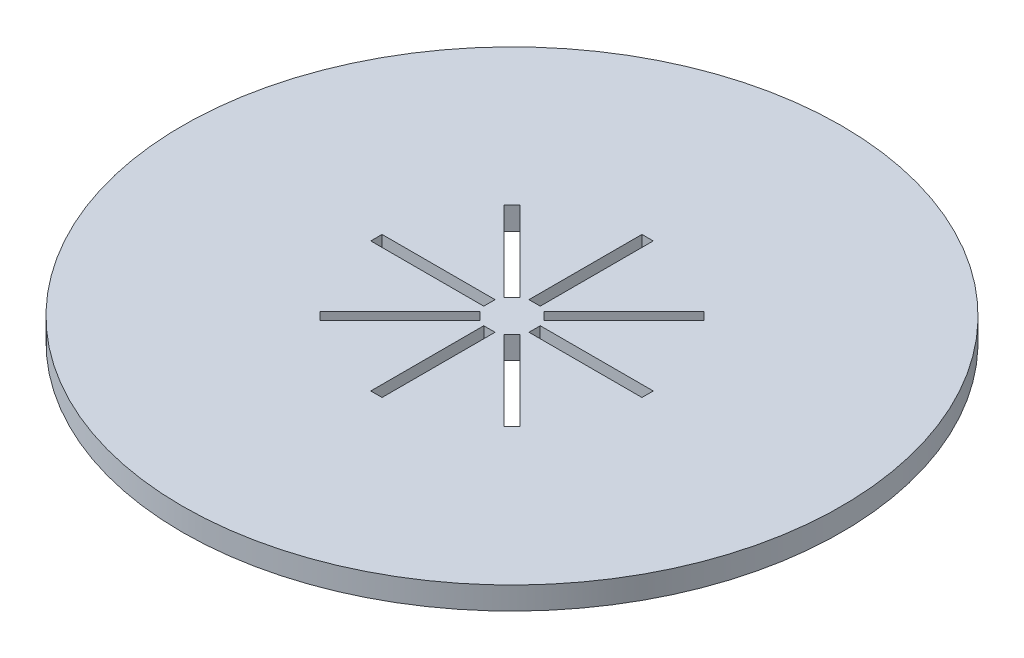
ISO-10303-21;
HEADER;
FILE_DESCRIPTION(('STEP AP214'),'2;1');
FILE_NAME('part.step','',(''),(''),'','','');
FILE_SCHEMA(('AUTOMOTIVE_DESIGN { 1 0 10303 214 1 1 1 1 }'));
ENDSEC;
DATA;
#1=APPLICATION_CONTEXT('core data for automotive mechanical design processes');
#2=APPLICATION_PROTOCOL_DEFINITION('international standard','automotive_design',2000,#1);
#3=PRODUCT_CONTEXT('',#1,'mechanical');
#4=PRODUCT('Part','Part','',(#3));
#5=PRODUCT_RELATED_PRODUCT_CATEGORY('part','',(#4));
#6=PRODUCT_DEFINITION_FORMATION('','',#4);
#7=PRODUCT_DEFINITION_CONTEXT('part definition',#1,'design');
#8=PRODUCT_DEFINITION('design','',#6,#7);
#9=PRODUCT_DEFINITION_SHAPE('','',#8);
#10=(LENGTH_UNIT() NAMED_UNIT(*) SI_UNIT(.MILLI.,.METRE.));
#11=(NAMED_UNIT(*) PLANE_ANGLE_UNIT() SI_UNIT($,.RADIAN.));
#12=(NAMED_UNIT(*) SI_UNIT($,.STERADIAN.) SOLID_ANGLE_UNIT());
#13=UNCERTAINTY_MEASURE_WITH_UNIT(LENGTH_MEASURE(1.E-05),#10,'distance_accuracy_value','');
#14=(GEOMETRIC_REPRESENTATION_CONTEXT(3) GLOBAL_UNCERTAINTY_ASSIGNED_CONTEXT((#13)) GLOBAL_UNIT_ASSIGNED_CONTEXT((#10,
#11,#12)) REPRESENTATION_CONTEXT('',''));
#15=CARTESIAN_POINT('',(0.,0.,0.));
#16=DIRECTION('',(0.,0.,1.));
#17=DIRECTION('',(1.,0.,0.));
#18=AXIS2_PLACEMENT_3D('',#15,#16,#17);
#19=CARTESIAN_POINT('',(0.,-6.,0.));
#20=DIRECTION('',(0.,1.,0.));
#21=DIRECTION('',(0.,0.,1.));
#22=AXIS2_PLACEMENT_3D('',#19,#20,#21);
#23=CYLINDRICAL_SURFACE('',#22,87.5);
#24=CARTESIAN_POINT('',(0.,-6.,0.));
#25=DIRECTION('',(0.,1.,0.));
#26=DIRECTION('',(0.,0.,1.));
#27=AXIS2_PLACEMENT_3D('',#24,#25,#26);
#28=CIRCLE('',#27,87.5);
#29=CARTESIAN_POINT('',(0.,-6.,87.5));
#30=VERTEX_POINT('',#29);
#31=EDGE_CURVE('E11',#30,#30,#28,.T.);
#32=ORIENTED_EDGE('',*,*,#31,.T.);
#33=EDGE_LOOP('',(#32));
#34=FACE_BOUND('',#33,.T.);
#35=CARTESIAN_POINT('',(0.,0.,0.));
#36=DIRECTION('',(0.,1.,0.));
#37=DIRECTION('',(0.,0.,1.));
#38=AXIS2_PLACEMENT_3D('',#35,#36,#37);
#39=CIRCLE('',#38,87.5);
#40=CARTESIAN_POINT('',(0.,0.,87.5));
#41=VERTEX_POINT('',#40);
#42=EDGE_CURVE('E42',#41,#41,#39,.T.);
#43=ORIENTED_EDGE('',*,*,#42,.F.);
#44=EDGE_LOOP('',(#43));
#45=FACE_BOUND('',#44,.T.);
#46=ADVANCED_FACE('F39',(#34,#45),#23,.T.);
#47=CARTESIAN_POINT('',(0.,-6.,0.));
#48=DIRECTION('',(0.,1.,0.));
#49=DIRECTION('',(0.,0.,1.));
#50=AXIS2_PLACEMENT_3D('',#47,#48,#49);
#51=PLANE('',#50);
#52=DIRECTION('',(-0.707106781186556,0.,-0.707106781186539));
#53=VECTOR('',#52,1.);
#54=CARTESIAN_POINT('',(1.06066017177981,-6.,-1.06066017177984));
#55=LINE('',#54,#53);
#56=CARTESIAN_POINT('',(-3.18198051533953,-6.,-5.30330085889907));
#57=VERTEX_POINT('',#56);
#58=CARTESIAN_POINT('',(-24.3951839509362,-6.,-26.5165042944952));
#59=VERTEX_POINT('',#58);
#60=EDGE_CURVE('E275',#57,#59,#55,.T.);
#61=ORIENTED_EDGE('',*,*,#60,.T.);
#62=DIRECTION('',(-0.707106781186539,0.,0.707106781186556));
#63=VECTOR('',#62,1.);
#64=CARTESIAN_POINT('',(-25.455844122716,-6.,-25.4558441227154));
#65=LINE('',#64,#63);
#66=CARTESIAN_POINT('',(-26.5165042944958,-6.,-24.3951839509356));
#67=VERTEX_POINT('',#66);
#68=EDGE_CURVE('E279',#59,#67,#65,.T.);
#69=ORIENTED_EDGE('',*,*,#68,.T.);
#70=DIRECTION('',(0.707106781186556,0.,0.707106781186539));
#71=VECTOR('',#70,1.);
#72=CARTESIAN_POINT('',(-1.06066017177981,-6.,1.06066017177984));
#73=LINE('',#72,#71);
#74=CARTESIAN_POINT('',(-5.30330085889915,-6.,-3.1819805153394));
#75=VERTEX_POINT('',#74);
#76=EDGE_CURVE('E256',#67,#75,#73,.T.);
#77=ORIENTED_EDGE('',*,*,#76,.T.);
#78=DIRECTION('',(0.707106781186539,0.,-0.707106781186556));
#79=VECTOR('',#78,1.);
#80=CARTESIAN_POINT('',(-4.24264068711934,-6.,-4.24264068711923));
#81=LINE('',#80,#79);
#82=EDGE_CURVE('E53',#75,#57,#81,.T.);
#83=ORIENTED_EDGE('',*,*,#82,.T.);
#84=EDGE_LOOP('',(#61,#69,#77,#83));
#85=FACE_BOUND('',#84,.T.);
#86=DIRECTION('',(0.,0.,-1.));
#87=VECTOR('',#86,1.);
#88=CARTESIAN_POINT('',(1.5,-6.,0.));
#89=LINE('',#88,#87);
#90=CARTESIAN_POINT('',(1.49999999999994,-6.,-6.00000000000002));
#91=VERTEX_POINT('',#90);
#92=CARTESIAN_POINT('',(1.49999999999963,-6.,-36.));
#93=VERTEX_POINT('',#92);
#94=EDGE_CURVE('E306',#91,#93,#89,.T.);
#95=ORIENTED_EDGE('',*,*,#94,.T.);
#96=DIRECTION('',(-1.,0.,0.));
#97=VECTOR('',#96,1.);
#98=CARTESIAN_POINT('',(-3.77080202999813E-13,-6.,-36.));
#99=LINE('',#98,#97);
#100=CARTESIAN_POINT('',(-1.50000000000037,-6.,-36.));
#101=VERTEX_POINT('',#100);
#102=EDGE_CURVE('E311',#93,#101,#99,.T.);
#103=ORIENTED_EDGE('',*,*,#102,.T.);
#104=DIRECTION('',(0.,0.,1.));
#105=VECTOR('',#104,1.);
#106=CARTESIAN_POINT('',(-1.5,-6.,0.));
#107=LINE('',#106,#105);
#108=CARTESIAN_POINT('',(-1.50000000000007,-6.,-5.99999999999998));
#109=VERTEX_POINT('',#108);
#110=EDGE_CURVE('E284',#101,#109,#107,.T.);
#111=ORIENTED_EDGE('',*,*,#110,.T.);
#112=DIRECTION('',(1.,0.,0.));
#113=VECTOR('',#112,1.);
#114=CARTESIAN_POINT('',(0.,-6.,-6.));
#115=LINE('',#114,#113);
#116=EDGE_CURVE('E298',#109,#91,#115,.T.);
#117=ORIENTED_EDGE('',*,*,#116,.T.);
#118=EDGE_LOOP('',(#95,#103,#111,#117));
#119=FACE_BOUND('',#118,.T.);
#120=DIRECTION('',(0.707106781186541,0.,-0.707106781186554));
#121=VECTOR('',#120,1.);
#122=CARTESIAN_POINT('',(1.06066017177983,-6.,1.06066017177981));
#123=LINE('',#122,#121);
#124=CARTESIAN_POINT('',(5.30330085889908,-6.,-3.18198051533951));
#125=VERTEX_POINT('',#124);
#126=CARTESIAN_POINT('',(26.5165042944953,-6.,-24.3951839509361));
#127=VERTEX_POINT('',#126);
#128=EDGE_CURVE('E338',#125,#127,#123,.T.);
#129=ORIENTED_EDGE('',*,*,#128,.T.);
#130=DIRECTION('',(-0.707106781186554,0.,-0.707106781186541));
#131=VECTOR('',#130,1.);
#132=CARTESIAN_POINT('',(25.4558441227155,-6.,-25.4558441227159));
#133=LINE('',#132,#131);
#134=CARTESIAN_POINT('',(24.3951839509357,-6.,-26.5165042944957));
#135=VERTEX_POINT('',#134);
#136=EDGE_CURVE('E343',#127,#135,#133,.T.);
#137=ORIENTED_EDGE('',*,*,#136,.T.);
#138=DIRECTION('',(-0.707106781186541,0.,0.707106781186554));
#139=VECTOR('',#138,1.);
#140=CARTESIAN_POINT('',(-1.06066017177983,-6.,-1.06066017177981));
#141=LINE('',#140,#139);
#142=CARTESIAN_POINT('',(3.18198051533942,-6.,-5.30330085889914));
#143=VERTEX_POINT('',#142);
#144=EDGE_CURVE('E316',#135,#143,#141,.T.);
#145=ORIENTED_EDGE('',*,*,#144,.T.);
#146=DIRECTION('',(0.707106781186554,0.,0.707106781186541));
#147=VECTOR('',#146,1.);
#148=CARTESIAN_POINT('',(4.24264068711925,-6.,-4.24264068711932));
#149=LINE('',#148,#147);
#150=EDGE_CURVE('E330',#143,#125,#149,.T.);
#151=ORIENTED_EDGE('',*,*,#150,.T.);
#152=EDGE_LOOP('',(#129,#137,#145,#151));
#153=FACE_BOUND('',#152,.T.);
#154=DIRECTION('',(1.,0.,0.));
#155=VECTOR('',#154,1.);
#156=CARTESIAN_POINT('',(0.,-6.,1.5));
#157=LINE('',#156,#155);
#158=CARTESIAN_POINT('',(6.,-6.,1.5));
#159=VERTEX_POINT('',#158);
#160=CARTESIAN_POINT('',(36.,-6.,1.5));
#161=VERTEX_POINT('',#160);
#162=EDGE_CURVE('E370',#159,#161,#157,.T.);
#163=ORIENTED_EDGE('',*,*,#162,.T.);
#164=DIRECTION('',(0.,0.,-1.));
#165=VECTOR('',#164,1.);
#166=CARTESIAN_POINT('',(36.,-6.,0.));
#167=LINE('',#166,#165);
#168=CARTESIAN_POINT('',(36.,-6.,-1.5));
#169=VERTEX_POINT('',#168);
#170=EDGE_CURVE('E375',#161,#169,#167,.T.);
#171=ORIENTED_EDGE('',*,*,#170,.T.);
#172=DIRECTION('',(-1.,0.,0.));
#173=VECTOR('',#172,1.);
#174=CARTESIAN_POINT('',(0.,-6.,-1.5));
#175=LINE('',#174,#173);
#176=CARTESIAN_POINT('',(6.,-6.,-1.5));
#177=VERTEX_POINT('',#176);
#178=EDGE_CURVE('E348',#169,#177,#175,.T.);
#179=ORIENTED_EDGE('',*,*,#178,.T.);
#180=DIRECTION('',(0.,0.,1.));
#181=VECTOR('',#180,1.);
#182=CARTESIAN_POINT('',(6.,-6.,0.));
#183=LINE('',#182,#181);
#184=EDGE_CURVE('E362',#177,#159,#183,.T.);
#185=ORIENTED_EDGE('',*,*,#184,.T.);
#186=EDGE_LOOP('',(#163,#171,#179,#185));
#187=FACE_BOUND('',#186,.T.);
#188=DIRECTION('',(0.707106781186551,0.,0.707106781186544));
#189=VECTOR('',#188,1.);
#190=CARTESIAN_POINT('',(-1.06066017177982,-6.,1.06066017177983));
#191=LINE('',#190,#189);
#192=CARTESIAN_POINT('',(3.18198051533949,-6.,5.30330085889909));
#193=VERTEX_POINT('',#192);
#194=CARTESIAN_POINT('',(24.395183950936,-6.,26.5165042944954));
#195=VERTEX_POINT('',#194);
#196=EDGE_CURVE('E402',#193,#195,#191,.T.);
#197=ORIENTED_EDGE('',*,*,#196,.T.);
#198=DIRECTION('',(0.707106781186544,0.,-0.707106781186551));
#199=VECTOR('',#198,1.);
#200=CARTESIAN_POINT('',(25.4558441227158,-6.,25.4558441227156));
#201=LINE('',#200,#199);
#202=CARTESIAN_POINT('',(26.5165042944957,-6.,24.3951839509358));
#203=VERTEX_POINT('',#202);
#204=EDGE_CURVE('E407',#195,#203,#201,.T.);
#205=ORIENTED_EDGE('',*,*,#204,.T.);
#206=DIRECTION('',(-0.707106781186551,0.,-0.707106781186544));
#207=VECTOR('',#206,1.);
#208=CARTESIAN_POINT('',(1.06066017177982,-6.,-1.06066017177983));
#209=LINE('',#208,#207);
#210=CARTESIAN_POINT('',(5.30330085889913,-6.,3.18198051533944));
#211=VERTEX_POINT('',#210);
#212=EDGE_CURVE('E380',#203,#211,#209,.T.);
#213=ORIENTED_EDGE('',*,*,#212,.T.);
#214=DIRECTION('',(-0.707106781186544,0.,0.707106781186551));
#215=VECTOR('',#214,1.);
#216=CARTESIAN_POINT('',(4.24264068711931,-6.,4.24264068711926));
#217=LINE('',#216,#215);
#218=EDGE_CURVE('E394',#211,#193,#217,.T.);
#219=ORIENTED_EDGE('',*,*,#218,.T.);
#220=EDGE_LOOP('',(#197,#205,#213,#219));
#221=FACE_BOUND('',#220,.T.);
#222=DIRECTION('',(0.,0.,1.));
#223=VECTOR('',#222,1.);
#224=CARTESIAN_POINT('',(-1.5,-6.,0.));
#225=LINE('',#224,#223);
#226=CARTESIAN_POINT('',(-1.49999999999998,-6.,6.00000000000001));
#227=VERTEX_POINT('',#226);
#228=CARTESIAN_POINT('',(-1.49999999999988,-6.,36.));
#229=VERTEX_POINT('',#228);
#230=EDGE_CURVE('E434',#227,#229,#225,.T.);
#231=ORIENTED_EDGE('',*,*,#230,.T.);
#232=DIRECTION('',(1.,0.,0.));
#233=VECTOR('',#232,1.);
#234=CARTESIAN_POINT('',(1.25693400999938E-13,-6.,36.));
#235=LINE('',#234,#233);
#236=CARTESIAN_POINT('',(1.50000000000012,-6.,36.));
#237=VERTEX_POINT('',#236);
#238=EDGE_CURVE('E439',#229,#237,#235,.T.);
#239=ORIENTED_EDGE('',*,*,#238,.T.);
#240=DIRECTION('',(0.,0.,-1.));
#241=VECTOR('',#240,1.);
#242=CARTESIAN_POINT('',(1.5,-6.,0.));
#243=LINE('',#242,#241);
#244=CARTESIAN_POINT('',(1.50000000000002,-6.,5.99999999999999));
#245=VERTEX_POINT('',#244);
#246=EDGE_CURVE('E412',#237,#245,#243,.T.);
#247=ORIENTED_EDGE('',*,*,#246,.T.);
#248=DIRECTION('',(-1.,0.,0.));
#249=VECTOR('',#248,1.);
#250=CARTESIAN_POINT('',(0.,-6.,6.));
#251=LINE('',#250,#249);
#252=EDGE_CURVE('E426',#245,#227,#251,.T.);
#253=ORIENTED_EDGE('',*,*,#252,.T.);
#254=EDGE_LOOP('',(#231,#239,#247,#253));
#255=FACE_BOUND('',#254,.T.);
#256=DIRECTION('',(-0.707106781186546,0.,0.707106781186549));
#257=VECTOR('',#256,1.);
#258=CARTESIAN_POINT('',(-1.06066017177982,-6.,-1.06066017177982));
#259=LINE('',#258,#257);
#260=CARTESIAN_POINT('',(-5.3033008588991,-6.,3.18198051533947));
#261=VERTEX_POINT('',#260);
#262=CARTESIAN_POINT('',(-26.5165042944955,-6.,24.3951839509359));
#263=VERTEX_POINT('',#262);
#264=EDGE_CURVE('E466',#261,#263,#259,.T.);
#265=ORIENTED_EDGE('',*,*,#264,.T.);
#266=DIRECTION('',(0.707106781186549,0.,0.707106781186546));
#267=VECTOR('',#266,1.);
#268=CARTESIAN_POINT('',(-25.4558441227157,-6.,25.4558441227158));
#269=LINE('',#268,#267);
#270=CARTESIAN_POINT('',(-24.3951839509358,-6.,26.5165042944956));
#271=VERTEX_POINT('',#270);
#272=EDGE_CURVE('E471',#263,#271,#269,.T.);
#273=ORIENTED_EDGE('',*,*,#272,.T.);
#274=DIRECTION('',(0.707106781186546,0.,-0.707106781186549));
#275=VECTOR('',#274,1.);
#276=CARTESIAN_POINT('',(1.06066017177983,-6.,1.06066017177982));
#277=LINE('',#276,#275);
#278=CARTESIAN_POINT('',(-3.18198051533945,-6.,5.30330085889912));
#279=VERTEX_POINT('',#278);
#280=EDGE_CURVE('E444',#271,#279,#277,.T.);
#281=ORIENTED_EDGE('',*,*,#280,.T.);
#282=DIRECTION('',(-0.707106781186549,0.,-0.707106781186546));
#283=VECTOR('',#282,1.);
#284=CARTESIAN_POINT('',(-4.24264068711928,-6.,4.24264068711929));
#285=LINE('',#284,#283);
#286=EDGE_CURVE('E458',#279,#261,#285,.T.);
#287=ORIENTED_EDGE('',*,*,#286,.T.);
#288=EDGE_LOOP('',(#265,#273,#281,#287));
#289=FACE_BOUND('',#288,.T.);
#290=DIRECTION('',(-1.,0.,0.));
#291=VECTOR('',#290,1.);
#292=CARTESIAN_POINT('',(0.,-6.,-1.5));
#293=LINE('',#292,#291);
#294=CARTESIAN_POINT('',(-6.,-6.,-1.5));
#295=VERTEX_POINT('',#294);
#296=CARTESIAN_POINT('',(-36.,-6.,-1.5));
#297=VERTEX_POINT('',#296);
#298=EDGE_CURVE('E500',#295,#297,#293,.T.);
#299=ORIENTED_EDGE('',*,*,#298,.T.);
#300=DIRECTION('',(0.,0.,1.));
#301=VECTOR('',#300,1.);
#302=CARTESIAN_POINT('',(-36.,-6.,0.));
#303=LINE('',#302,#301);
#304=CARTESIAN_POINT('',(-36.,-6.,1.5));
#305=VERTEX_POINT('',#304);
#306=EDGE_CURVE('E503',#297,#305,#303,.T.);
#307=ORIENTED_EDGE('',*,*,#306,.T.);
#308=DIRECTION('',(1.,0.,0.));
#309=VECTOR('',#308,1.);
#310=CARTESIAN_POINT('',(0.,-6.,1.5));
#311=LINE('',#310,#309);
#312=CARTESIAN_POINT('',(-6.,-6.,1.5));
#313=VERTEX_POINT('',#312);
#314=EDGE_CURVE('E488',#305,#313,#311,.T.);
#315=ORIENTED_EDGE('',*,*,#314,.T.);
#316=DIRECTION('',(0.,0.,-1.));
#317=VECTOR('',#316,1.);
#318=CARTESIAN_POINT('',(-6.,-6.,0.));
#319=LINE('',#318,#317);
#320=EDGE_CURVE('E497',#313,#295,#319,.T.);
#321=ORIENTED_EDGE('',*,*,#320,.T.);
#322=EDGE_LOOP('',(#299,#307,#315,#321));
#323=FACE_BOUND('',#322,.T.);
#324=ORIENTED_EDGE('',*,*,#31,.F.);
#325=EDGE_LOOP('',(#324));
#326=FACE_BOUND('',#325,.T.);
#327=ADVANCED_FACE('F511',(#85,#119,#153,#187,#221,#255,#289,#323,#326),#51,.F.);
#328=CARTESIAN_POINT('',(0.,0.,0.));
#329=DIRECTION('',(0.,1.,0.));
#330=DIRECTION('',(0.,0.,1.));
#331=AXIS2_PLACEMENT_3D('',#328,#329,#330);
#332=PLANE('',#331);
#333=DIRECTION('',(-0.707106781186539,0.,0.707106781186556));
#334=VECTOR('',#333,1.);
#335=CARTESIAN_POINT('',(-24.3951839509362,0.,-26.5165042944952));
#336=LINE('',#335,#334);
#337=CARTESIAN_POINT('',(-24.3951839509362,0.,-26.5165042944952));
#338=VERTEX_POINT('',#337);
#339=CARTESIAN_POINT('',(-26.5165042944958,0.,-24.3951839509356));
#340=VERTEX_POINT('',#339);
#341=EDGE_CURVE('E61',#338,#340,#336,.T.);
#342=ORIENTED_EDGE('',*,*,#341,.F.);
#343=DIRECTION('',(-0.707106781186556,0.,-0.707106781186539));
#344=VECTOR('',#343,1.);
#345=CARTESIAN_POINT('',(-24.3951839509362,0.,-26.5165042944952));
#346=LINE('',#345,#344);
#347=CARTESIAN_POINT('',(-3.18198051533953,0.,-5.30330085889907));
#348=VERTEX_POINT('',#347);
#349=EDGE_CURVE('E265',#348,#338,#346,.T.);
#350=ORIENTED_EDGE('',*,*,#349,.F.);
#351=DIRECTION('',(0.707106781186539,0.,-0.707106781186556));
#352=VECTOR('',#351,1.);
#353=CARTESIAN_POINT('',(-3.18198051533953,0.,-5.30330085889907));
#354=LINE('',#353,#352);
#355=CARTESIAN_POINT('',(-5.30330085889915,0.,-3.1819805153394));
#356=VERTEX_POINT('',#355);
#357=EDGE_CURVE('E259',#356,#348,#354,.T.);
#358=ORIENTED_EDGE('',*,*,#357,.F.);
#359=DIRECTION('',(0.707106781186556,0.,0.707106781186539));
#360=VECTOR('',#359,1.);
#361=CARTESIAN_POINT('',(-26.5165042944958,0.,-24.3951839509356));
#362=LINE('',#361,#360);
#363=EDGE_CURVE('E249',#340,#356,#362,.T.);
#364=ORIENTED_EDGE('',*,*,#363,.F.);
#365=EDGE_LOOP('',(#342,#350,#358,#364));
#366=FACE_BOUND('',#365,.T.);
#367=DIRECTION('',(-1.,0.,0.));
#368=VECTOR('',#367,1.);
#369=CARTESIAN_POINT('',(1.49999999999963,0.,-36.));
#370=LINE('',#369,#368);
#371=CARTESIAN_POINT('',(1.49999999999963,0.,-36.));
#372=VERTEX_POINT('',#371);
#373=CARTESIAN_POINT('',(-1.50000000000037,0.,-36.));
#374=VERTEX_POINT('',#373);
#375=EDGE_CURVE('E309',#372,#374,#370,.T.);
#376=ORIENTED_EDGE('',*,*,#375,.F.);
#377=DIRECTION('',(0.,0.,-1.));
#378=VECTOR('',#377,1.);
#379=CARTESIAN_POINT('',(1.49999999999963,0.,-36.));
#380=LINE('',#379,#378);
#381=CARTESIAN_POINT('',(1.49999999999994,0.,-6.00000000000002));
#382=VERTEX_POINT('',#381);
#383=EDGE_CURVE('E301',#382,#372,#380,.T.);
#384=ORIENTED_EDGE('',*,*,#383,.F.);
#385=DIRECTION('',(1.,0.,0.));
#386=VECTOR('',#385,1.);
#387=CARTESIAN_POINT('',(1.49999999999994,0.,-6.00000000000002));
#388=LINE('',#387,#386);
#389=CARTESIAN_POINT('',(-1.50000000000007,0.,-5.99999999999998));
#390=VERTEX_POINT('',#389);
#391=EDGE_CURVE('E293',#390,#382,#388,.T.);
#392=ORIENTED_EDGE('',*,*,#391,.F.);
#393=DIRECTION('',(0.,0.,1.));
#394=VECTOR('',#393,1.);
#395=CARTESIAN_POINT('',(-1.50000000000037,0.,-36.));
#396=LINE('',#395,#394);
#397=EDGE_CURVE('E282',#374,#390,#396,.T.);
#398=ORIENTED_EDGE('',*,*,#397,.F.);
#399=EDGE_LOOP('',(#376,#384,#392,#398));
#400=FACE_BOUND('',#399,.T.);
#401=DIRECTION('',(-0.707106781186554,0.,-0.707106781186541));
#402=VECTOR('',#401,1.);
#403=CARTESIAN_POINT('',(26.5165042944953,0.,-24.3951839509361));
#404=LINE('',#403,#402);
#405=CARTESIAN_POINT('',(26.5165042944953,0.,-24.3951839509361));
#406=VERTEX_POINT('',#405);
#407=CARTESIAN_POINT('',(24.3951839509357,0.,-26.5165042944957));
#408=VERTEX_POINT('',#407);
#409=EDGE_CURVE('E341',#406,#408,#404,.T.);
#410=ORIENTED_EDGE('',*,*,#409,.F.);
#411=DIRECTION('',(0.707106781186541,0.,-0.707106781186554));
#412=VECTOR('',#411,1.);
#413=CARTESIAN_POINT('',(26.5165042944953,0.,-24.3951839509361));
#414=LINE('',#413,#412);
#415=CARTESIAN_POINT('',(5.30330085889908,0.,-3.18198051533951));
#416=VERTEX_POINT('',#415);
#417=EDGE_CURVE('E333',#416,#406,#414,.T.);
#418=ORIENTED_EDGE('',*,*,#417,.F.);
#419=DIRECTION('',(0.707106781186554,0.,0.707106781186541));
#420=VECTOR('',#419,1.);
#421=CARTESIAN_POINT('',(5.30330085889908,0.,-3.18198051533951));
#422=LINE('',#421,#420);
#423=CARTESIAN_POINT('',(3.18198051533942,0.,-5.30330085889914));
#424=VERTEX_POINT('',#423);
#425=EDGE_CURVE('E325',#424,#416,#422,.T.);
#426=ORIENTED_EDGE('',*,*,#425,.F.);
#427=DIRECTION('',(-0.707106781186541,0.,0.707106781186554));
#428=VECTOR('',#427,1.);
#429=CARTESIAN_POINT('',(24.3951839509357,0.,-26.5165042944957));
#430=LINE('',#429,#428);
#431=EDGE_CURVE('E314',#408,#424,#430,.T.);
#432=ORIENTED_EDGE('',*,*,#431,.F.);
#433=EDGE_LOOP('',(#410,#418,#426,#432));
#434=FACE_BOUND('',#433,.T.);
#435=DIRECTION('',(0.,0.,-1.));
#436=VECTOR('',#435,1.);
#437=CARTESIAN_POINT('',(36.,0.,1.5));
#438=LINE('',#437,#436);
#439=CARTESIAN_POINT('',(36.,0.,1.5));
#440=VERTEX_POINT('',#439);
#441=CARTESIAN_POINT('',(36.,0.,-1.5));
#442=VERTEX_POINT('',#441);
#443=EDGE_CURVE('E373',#440,#442,#438,.T.);
#444=ORIENTED_EDGE('',*,*,#443,.F.);
#445=DIRECTION('',(1.,0.,0.));
#446=VECTOR('',#445,1.);
#447=CARTESIAN_POINT('',(36.,0.,1.5));
#448=LINE('',#447,#446);
#449=CARTESIAN_POINT('',(6.,0.,1.5));
#450=VERTEX_POINT('',#449);
#451=EDGE_CURVE('E365',#450,#440,#448,.T.);
#452=ORIENTED_EDGE('',*,*,#451,.F.);
#453=DIRECTION('',(0.,0.,1.));
#454=VECTOR('',#453,1.);
#455=CARTESIAN_POINT('',(6.,0.,1.5));
#456=LINE('',#455,#454);
#457=CARTESIAN_POINT('',(6.,0.,-1.5));
#458=VERTEX_POINT('',#457);
#459=EDGE_CURVE('E357',#458,#450,#456,.T.);
#460=ORIENTED_EDGE('',*,*,#459,.F.);
#461=DIRECTION('',(-1.,0.,0.));
#462=VECTOR('',#461,1.);
#463=CARTESIAN_POINT('',(36.,0.,-1.5));
#464=LINE('',#463,#462);
#465=EDGE_CURVE('E346',#442,#458,#464,.T.);
#466=ORIENTED_EDGE('',*,*,#465,.F.);
#467=EDGE_LOOP('',(#444,#452,#460,#466));
#468=FACE_BOUND('',#467,.T.);
#469=DIRECTION('',(0.707106781186544,0.,-0.707106781186551));
#470=VECTOR('',#469,1.);
#471=CARTESIAN_POINT('',(24.395183950936,0.,26.5165042944954));
#472=LINE('',#471,#470);
#473=CARTESIAN_POINT('',(24.395183950936,0.,26.5165042944954));
#474=VERTEX_POINT('',#473);
#475=CARTESIAN_POINT('',(26.5165042944957,0.,24.3951839509358));
#476=VERTEX_POINT('',#475);
#477=EDGE_CURVE('E405',#474,#476,#472,.T.);
#478=ORIENTED_EDGE('',*,*,#477,.F.);
#479=DIRECTION('',(0.707106781186551,0.,0.707106781186544));
#480=VECTOR('',#479,1.);
#481=CARTESIAN_POINT('',(24.395183950936,0.,26.5165042944954));
#482=LINE('',#481,#480);
#483=CARTESIAN_POINT('',(3.18198051533949,0.,5.30330085889909));
#484=VERTEX_POINT('',#483);
#485=EDGE_CURVE('E397',#484,#474,#482,.T.);
#486=ORIENTED_EDGE('',*,*,#485,.F.);
#487=DIRECTION('',(-0.707106781186544,0.,0.707106781186551));
#488=VECTOR('',#487,1.);
#489=CARTESIAN_POINT('',(3.18198051533949,0.,5.30330085889909));
#490=LINE('',#489,#488);
#491=CARTESIAN_POINT('',(5.30330085889913,0.,3.18198051533943));
#492=VERTEX_POINT('',#491);
#493=EDGE_CURVE('E389',#492,#484,#490,.T.);
#494=ORIENTED_EDGE('',*,*,#493,.F.);
#495=DIRECTION('',(-0.707106781186551,0.,-0.707106781186544));
#496=VECTOR('',#495,1.);
#497=CARTESIAN_POINT('',(26.5165042944957,0.,24.3951839509358));
#498=LINE('',#497,#496);
#499=EDGE_CURVE('E378',#476,#492,#498,.T.);
#500=ORIENTED_EDGE('',*,*,#499,.F.);
#501=EDGE_LOOP('',(#478,#486,#494,#500));
#502=FACE_BOUND('',#501,.T.);
#503=DIRECTION('',(1.,0.,0.));
#504=VECTOR('',#503,1.);
#505=CARTESIAN_POINT('',(-1.49999999999988,0.,36.));
#506=LINE('',#505,#504);
#507=CARTESIAN_POINT('',(-1.49999999999988,0.,36.));
#508=VERTEX_POINT('',#507);
#509=CARTESIAN_POINT('',(1.50000000000012,0.,36.));
#510=VERTEX_POINT('',#509);
#511=EDGE_CURVE('E437',#508,#510,#506,.T.);
#512=ORIENTED_EDGE('',*,*,#511,.F.);
#513=DIRECTION('',(0.,0.,1.));
#514=VECTOR('',#513,1.);
#515=CARTESIAN_POINT('',(-1.49999999999988,0.,36.));
#516=LINE('',#515,#514);
#517=CARTESIAN_POINT('',(-1.49999999999998,0.,6.00000000000001));
#518=VERTEX_POINT('',#517);
#519=EDGE_CURVE('E429',#518,#508,#516,.T.);
#520=ORIENTED_EDGE('',*,*,#519,.F.);
#521=DIRECTION('',(-1.,0.,0.));
#522=VECTOR('',#521,1.);
#523=CARTESIAN_POINT('',(-1.49999999999998,0.,6.00000000000001));
#524=LINE('',#523,#522);
#525=CARTESIAN_POINT('',(1.50000000000002,0.,5.99999999999999));
#526=VERTEX_POINT('',#525);
#527=EDGE_CURVE('E421',#526,#518,#524,.T.);
#528=ORIENTED_EDGE('',*,*,#527,.F.);
#529=DIRECTION('',(0.,0.,-1.));
#530=VECTOR('',#529,1.);
#531=CARTESIAN_POINT('',(1.50000000000012,0.,36.));
#532=LINE('',#531,#530);
#533=EDGE_CURVE('E410',#510,#526,#532,.T.);
#534=ORIENTED_EDGE('',*,*,#533,.F.);
#535=EDGE_LOOP('',(#512,#520,#528,#534));
#536=FACE_BOUND('',#535,.T.);
#537=DIRECTION('',(0.707106781186549,0.,0.707106781186546));
#538=VECTOR('',#537,1.);
#539=CARTESIAN_POINT('',(-26.5165042944955,0.,24.3951839509359));
#540=LINE('',#539,#538);
#541=CARTESIAN_POINT('',(-26.5165042944955,0.,24.3951839509359));
#542=VERTEX_POINT('',#541);
#543=CARTESIAN_POINT('',(-24.3951839509358,0.,26.5165042944956));
#544=VERTEX_POINT('',#543);
#545=EDGE_CURVE('E469',#542,#544,#540,.T.);
#546=ORIENTED_EDGE('',*,*,#545,.F.);
#547=DIRECTION('',(-0.707106781186546,0.,0.707106781186549));
#548=VECTOR('',#547,1.);
#549=CARTESIAN_POINT('',(-26.5165042944955,0.,24.3951839509359));
#550=LINE('',#549,#548);
#551=CARTESIAN_POINT('',(-5.3033008588991,0.,3.18198051533947));
#552=VERTEX_POINT('',#551);
#553=EDGE_CURVE('E461',#552,#542,#550,.T.);
#554=ORIENTED_EDGE('',*,*,#553,.F.);
#555=DIRECTION('',(-0.707106781186549,0.,-0.707106781186546));
#556=VECTOR('',#555,1.);
#557=CARTESIAN_POINT('',(-5.3033008588991,0.,3.18198051533947));
#558=LINE('',#557,#556);
#559=CARTESIAN_POINT('',(-3.18198051533945,0.,5.30330085889911));
#560=VERTEX_POINT('',#559);
#561=EDGE_CURVE('E453',#560,#552,#558,.T.);
#562=ORIENTED_EDGE('',*,*,#561,.F.);
#563=DIRECTION('',(0.707106781186546,0.,-0.707106781186549));
#564=VECTOR('',#563,1.);
#565=CARTESIAN_POINT('',(-24.3951839509358,0.,26.5165042944956));
#566=LINE('',#565,#564);
#567=EDGE_CURVE('E442',#544,#560,#566,.T.);
#568=ORIENTED_EDGE('',*,*,#567,.F.);
#569=EDGE_LOOP('',(#546,#554,#562,#568));
#570=FACE_BOUND('',#569,.T.);
#571=DIRECTION('',(0.,0.,1.));
#572=VECTOR('',#571,1.);
#573=CARTESIAN_POINT('',(-36.,0.,-1.5));
#574=LINE('',#573,#572);
#575=CARTESIAN_POINT('',(-36.,0.,-1.5));
#576=VERTEX_POINT('',#575);
#577=CARTESIAN_POINT('',(-36.,0.,1.5));
#578=VERTEX_POINT('',#577);
#579=EDGE_CURVE('E474',#576,#578,#574,.T.);
#580=ORIENTED_EDGE('',*,*,#579,.F.);
#581=DIRECTION('',(-1.,0.,0.));
#582=VECTOR('',#581,1.);
#583=CARTESIAN_POINT('',(-36.,0.,-1.5));
#584=LINE('',#583,#582);
#585=CARTESIAN_POINT('',(-6.,0.,-1.5));
#586=VERTEX_POINT('',#585);
#587=EDGE_CURVE('E482',#586,#576,#584,.T.);
#588=ORIENTED_EDGE('',*,*,#587,.F.);
#589=DIRECTION('',(0.,0.,-1.));
#590=VECTOR('',#589,1.);
#591=CARTESIAN_POINT('',(-6.,0.,-1.5));
#592=LINE('',#591,#590);
#593=CARTESIAN_POINT('',(-6.,0.,1.5));
#594=VERTEX_POINT('',#593);
#595=EDGE_CURVE('E479',#594,#586,#592,.T.);
#596=ORIENTED_EDGE('',*,*,#595,.F.);
#597=DIRECTION('',(1.,0.,0.));
#598=VECTOR('',#597,1.);
#599=CARTESIAN_POINT('',(-36.,0.,1.5));
#600=LINE('',#599,#598);
#601=EDGE_CURVE('E476',#578,#594,#600,.T.);
#602=ORIENTED_EDGE('',*,*,#601,.F.);
#603=EDGE_LOOP('',(#580,#588,#596,#602));
#604=FACE_BOUND('',#603,.T.);
#605=ORIENTED_EDGE('',*,*,#42,.T.);
#606=EDGE_LOOP('',(#605));
#607=FACE_BOUND('',#606,.T.);
#608=ADVANCED_FACE('F263',(#366,#400,#434,#468,#502,#536,#570,#604,#607),#332,.T.);
#609=CARTESIAN_POINT('',(-36.,-10.,-1.5));
#610=DIRECTION('',(-1.,0.,0.));
#611=DIRECTION('',(0.,0.,1.));
#612=AXIS2_PLACEMENT_3D('',#609,#610,#611);
#613=PLANE('',#612);
#614=DIRECTION('',(0.,1.,0.));
#615=VECTOR('',#614,1.);
#616=CARTESIAN_POINT('',(-36.,-10.,-1.5));
#617=LINE('',#616,#615);
#618=EDGE_CURVE('E486',#297,#576,#617,.T.);
#619=ORIENTED_EDGE('',*,*,#618,.T.);
#620=ORIENTED_EDGE('',*,*,#579,.T.);
#621=DIRECTION('',(0.,1.,0.));
#622=VECTOR('',#621,1.);
#623=CARTESIAN_POINT('',(-36.,-10.,1.5));
#624=LINE('',#623,#622);
#625=EDGE_CURVE('E485',#305,#578,#624,.T.);
#626=ORIENTED_EDGE('',*,*,#625,.F.);
#627=ORIENTED_EDGE('',*,*,#306,.F.);
#628=EDGE_LOOP('',(#619,#620,#626,#627));
#629=FACE_BOUND('',#628,.T.);
#630=ADVANCED_FACE('F523',(#629),#613,.F.);
#631=CARTESIAN_POINT('',(-36.,-10.,-1.5));
#632=DIRECTION('',(0.,0.,-1.));
#633=DIRECTION('',(-1.,0.,0.));
#634=AXIS2_PLACEMENT_3D('',#631,#632,#633);
#635=PLANE('',#634);
#636=DIRECTION('',(0.,1.,0.));
#637=VECTOR('',#636,1.);
#638=CARTESIAN_POINT('',(-6.,-10.,-1.5));
#639=LINE('',#638,#637);
#640=EDGE_CURVE('E489',#295,#586,#639,.T.);
#641=ORIENTED_EDGE('',*,*,#640,.T.);
#642=ORIENTED_EDGE('',*,*,#587,.T.);
#643=ORIENTED_EDGE('',*,*,#618,.F.);
#644=ORIENTED_EDGE('',*,*,#298,.F.);
#645=EDGE_LOOP('',(#641,#642,#643,#644));
#646=FACE_BOUND('',#645,.T.);
#647=ADVANCED_FACE('F528',(#646),#635,.F.);
#648=CARTESIAN_POINT('',(-6.,-10.,-1.5));
#649=DIRECTION('',(1.,0.,0.));
#650=DIRECTION('',(0.,0.,-1.));
#651=AXIS2_PLACEMENT_3D('',#648,#649,#650);
#652=PLANE('',#651);
#653=DIRECTION('',(0.,1.,0.));
#654=VECTOR('',#653,1.);
#655=CARTESIAN_POINT('',(-6.,-10.,1.5));
#656=LINE('',#655,#654);
#657=EDGE_CURVE('E491',#313,#594,#656,.T.);
#658=ORIENTED_EDGE('',*,*,#657,.T.);
#659=ORIENTED_EDGE('',*,*,#595,.T.);
#660=ORIENTED_EDGE('',*,*,#640,.F.);
#661=ORIENTED_EDGE('',*,*,#320,.F.);
#662=EDGE_LOOP('',(#658,#659,#660,#661));
#663=FACE_BOUND('',#662,.T.);
#664=ADVANCED_FACE('F534',(#663),#652,.F.);
#665=CARTESIAN_POINT('',(-36.,-10.,1.5));
#666=DIRECTION('',(0.,0.,1.));
#667=DIRECTION('',(1.,0.,0.));
#668=AXIS2_PLACEMENT_3D('',#665,#666,#667);
#669=PLANE('',#668);
#670=ORIENTED_EDGE('',*,*,#625,.T.);
#671=ORIENTED_EDGE('',*,*,#601,.T.);
#672=ORIENTED_EDGE('',*,*,#657,.F.);
#673=ORIENTED_EDGE('',*,*,#314,.F.);
#674=EDGE_LOOP('',(#670,#671,#672,#673));
#675=FACE_BOUND('',#674,.T.);
#676=ADVANCED_FACE('F530',(#675),#669,.F.);
#677=CARTESIAN_POINT('',(-26.5165042944955,-10.,24.3951839509359));
#678=DIRECTION('',(-0.707106781186546,0.,0.707106781186549));
#679=DIRECTION('',(0.707106781186549,0.,0.707106781186546));
#680=AXIS2_PLACEMENT_3D('',#677,#678,#679);
#681=PLANE('',#680);
#682=DIRECTION('',(0.,1.,0.));
#683=VECTOR('',#682,1.);
#684=CARTESIAN_POINT('',(-26.5165042944955,-10.,24.3951839509359));
#685=LINE('',#684,#683);
#686=EDGE_CURVE('E463',#263,#542,#685,.T.);
#687=ORIENTED_EDGE('',*,*,#686,.T.);
#688=ORIENTED_EDGE('',*,*,#545,.T.);
#689=DIRECTION('',(0.,1.,0.));
#690=VECTOR('',#689,1.);
#691=CARTESIAN_POINT('',(-24.3951839509358,-10.,26.5165042944956));
#692=LINE('',#691,#690);
#693=EDGE_CURVE('E447',#271,#544,#692,.T.);
#694=ORIENTED_EDGE('',*,*,#693,.F.);
#695=ORIENTED_EDGE('',*,*,#272,.F.);
#696=EDGE_LOOP('',(#687,#688,#694,#695));
#697=FACE_BOUND('',#696,.T.);
#698=ADVANCED_FACE('F533',(#697),#681,.F.);
#699=CARTESIAN_POINT('',(-26.5165042944955,-10.,24.3951839509359));
#700=DIRECTION('',(-0.707106781186549,0.,-0.707106781186546));
#701=DIRECTION('',(-0.707106781186546,0.,0.707106781186549));
#702=AXIS2_PLACEMENT_3D('',#699,#700,#701);
#703=PLANE('',#702);
#704=DIRECTION('',(0.,1.,0.));
#705=VECTOR('',#704,1.);
#706=CARTESIAN_POINT('',(-5.3033008588991,-10.,3.18198051533947));
#707=LINE('',#706,#705);
#708=EDGE_CURVE('E455',#261,#552,#707,.T.);
#709=ORIENTED_EDGE('',*,*,#708,.T.);
#710=ORIENTED_EDGE('',*,*,#553,.T.);
#711=ORIENTED_EDGE('',*,*,#686,.F.);
#712=ORIENTED_EDGE('',*,*,#264,.F.);
#713=EDGE_LOOP('',(#709,#710,#711,#712));
#714=FACE_BOUND('',#713,.T.);
#715=ADVANCED_FACE('F544',(#714),#703,.F.);
#716=CARTESIAN_POINT('',(-5.3033008588991,-10.,3.18198051533947));
#717=DIRECTION('',(0.707106781186546,0.,-0.707106781186549));
#718=DIRECTION('',(-0.707106781186549,0.,-0.707106781186546));
#719=AXIS2_PLACEMENT_3D('',#716,#717,#718);
#720=PLANE('',#719);
#721=DIRECTION('',(0.,1.,0.));
#722=VECTOR('',#721,1.);
#723=CARTESIAN_POINT('',(-3.18198051533945,-10.,5.30330085889911));
#724=LINE('',#723,#722);
#725=EDGE_CURVE('E450',#279,#560,#724,.T.);
#726=ORIENTED_EDGE('',*,*,#725,.T.);
#727=ORIENTED_EDGE('',*,*,#561,.T.);
#728=ORIENTED_EDGE('',*,*,#708,.F.);
#729=ORIENTED_EDGE('',*,*,#286,.F.);
#730=EDGE_LOOP('',(#726,#727,#728,#729));
#731=FACE_BOUND('',#730,.T.);
#732=ADVANCED_FACE('F548',(#731),#720,.F.);
#733=CARTESIAN_POINT('',(-24.3951839509358,-10.,26.5165042944956));
#734=DIRECTION('',(0.707106781186549,0.,0.707106781186546));
#735=DIRECTION('',(0.707106781186546,0.,-0.707106781186549));
#736=AXIS2_PLACEMENT_3D('',#733,#734,#735);
#737=PLANE('',#736);
#738=ORIENTED_EDGE('',*,*,#693,.T.);
#739=ORIENTED_EDGE('',*,*,#567,.T.);
#740=ORIENTED_EDGE('',*,*,#725,.F.);
#741=ORIENTED_EDGE('',*,*,#280,.F.);
#742=EDGE_LOOP('',(#738,#739,#740,#741));
#743=FACE_BOUND('',#742,.T.);
#744=ADVANCED_FACE('F552',(#743),#737,.F.);
#745=CARTESIAN_POINT('',(-1.49999999999988,-10.,36.));
#746=DIRECTION('',(0.,0.,1.));
#747=DIRECTION('',(1.,0.,0.));
#748=AXIS2_PLACEMENT_3D('',#745,#746,#747);
#749=PLANE('',#748);
#750=DIRECTION('',(0.,1.,0.));
#751=VECTOR('',#750,1.);
#752=CARTESIAN_POINT('',(-1.49999999999988,-10.,36.));
#753=LINE('',#752,#751);
#754=EDGE_CURVE('E431',#229,#508,#753,.T.);
#755=ORIENTED_EDGE('',*,*,#754,.T.);
#756=ORIENTED_EDGE('',*,*,#511,.T.);
#757=DIRECTION('',(0.,1.,0.));
#758=VECTOR('',#757,1.);
#759=CARTESIAN_POINT('',(1.50000000000012,-10.,36.));
#760=LINE('',#759,#758);
#761=EDGE_CURVE('E415',#237,#510,#760,.T.);
#762=ORIENTED_EDGE('',*,*,#761,.F.);
#763=ORIENTED_EDGE('',*,*,#238,.F.);
#764=EDGE_LOOP('',(#755,#756,#762,#763));
#765=FACE_BOUND('',#764,.T.);
#766=ADVANCED_FACE('F556',(#765),#749,.F.);
#767=CARTESIAN_POINT('',(-1.49999999999988,-10.,36.));
#768=DIRECTION('',(-1.,0.,0.));
#769=DIRECTION('',(0.,0.,1.));
#770=AXIS2_PLACEMENT_3D('',#767,#768,#769);
#771=PLANE('',#770);
#772=DIRECTION('',(0.,1.,0.));
#773=VECTOR('',#772,1.);
#774=CARTESIAN_POINT('',(-1.49999999999998,-10.,6.00000000000001));
#775=LINE('',#774,#773);
#776=EDGE_CURVE('E423',#227,#518,#775,.T.);
#777=ORIENTED_EDGE('',*,*,#776,.T.);
#778=ORIENTED_EDGE('',*,*,#519,.T.);
#779=ORIENTED_EDGE('',*,*,#754,.F.);
#780=ORIENTED_EDGE('',*,*,#230,.F.);
#781=EDGE_LOOP('',(#777,#778,#779,#780));
#782=FACE_BOUND('',#781,.T.);
#783=ADVANCED_FACE('F560',(#782),#771,.F.);
#784=CARTESIAN_POINT('',(-1.49999999999998,-10.,6.00000000000001));
#785=DIRECTION('',(0.,0.,-1.));
#786=DIRECTION('',(-1.,0.,0.));
#787=AXIS2_PLACEMENT_3D('',#784,#785,#786);
#788=PLANE('',#787);
#789=DIRECTION('',(0.,1.,0.));
#790=VECTOR('',#789,1.);
#791=CARTESIAN_POINT('',(1.50000000000002,-10.,5.99999999999999));
#792=LINE('',#791,#790);
#793=EDGE_CURVE('E418',#245,#526,#792,.T.);
#794=ORIENTED_EDGE('',*,*,#793,.T.);
#795=ORIENTED_EDGE('',*,*,#527,.T.);
#796=ORIENTED_EDGE('',*,*,#776,.F.);
#797=ORIENTED_EDGE('',*,*,#252,.F.);
#798=EDGE_LOOP('',(#794,#795,#796,#797));
#799=FACE_BOUND('',#798,.T.);
#800=ADVANCED_FACE('F564',(#799),#788,.F.);
#801=CARTESIAN_POINT('',(1.50000000000012,-10.,36.));
#802=DIRECTION('',(1.,0.,0.));
#803=DIRECTION('',(0.,0.,-1.));
#804=AXIS2_PLACEMENT_3D('',#801,#802,#803);
#805=PLANE('',#804);
#806=ORIENTED_EDGE('',*,*,#761,.T.);
#807=ORIENTED_EDGE('',*,*,#533,.T.);
#808=ORIENTED_EDGE('',*,*,#793,.F.);
#809=ORIENTED_EDGE('',*,*,#246,.F.);
#810=EDGE_LOOP('',(#806,#807,#808,#809));
#811=FACE_BOUND('',#810,.T.);
#812=ADVANCED_FACE('F568',(#811),#805,.F.);
#813=CARTESIAN_POINT('',(24.395183950936,-10.,26.5165042944954));
#814=DIRECTION('',(0.707106781186551,0.,0.707106781186544));
#815=DIRECTION('',(0.707106781186544,0.,-0.707106781186551));
#816=AXIS2_PLACEMENT_3D('',#813,#814,#815);
#817=PLANE('',#816);
#818=DIRECTION('',(0.,1.,0.));
#819=VECTOR('',#818,1.);
#820=CARTESIAN_POINT('',(24.395183950936,-10.,26.5165042944954));
#821=LINE('',#820,#819);
#822=EDGE_CURVE('E399',#195,#474,#821,.T.);
#823=ORIENTED_EDGE('',*,*,#822,.T.);
#824=ORIENTED_EDGE('',*,*,#477,.T.);
#825=DIRECTION('',(0.,1.,0.));
#826=VECTOR('',#825,1.);
#827=CARTESIAN_POINT('',(26.5165042944957,-10.,24.3951839509358));
#828=LINE('',#827,#826);
#829=EDGE_CURVE('E383',#203,#476,#828,.T.);
#830=ORIENTED_EDGE('',*,*,#829,.F.);
#831=ORIENTED_EDGE('',*,*,#204,.F.);
#832=EDGE_LOOP('',(#823,#824,#830,#831));
#833=FACE_BOUND('',#832,.T.);
#834=ADVANCED_FACE('F572',(#833),#817,.F.);
#835=CARTESIAN_POINT('',(24.395183950936,-10.,26.5165042944954));
#836=DIRECTION('',(-0.707106781186544,0.,0.707106781186551));
#837=DIRECTION('',(0.707106781186551,0.,0.707106781186544));
#838=AXIS2_PLACEMENT_3D('',#835,#836,#837);
#839=PLANE('',#838);
#840=DIRECTION('',(0.,1.,0.));
#841=VECTOR('',#840,1.);
#842=CARTESIAN_POINT('',(3.18198051533949,-10.,5.30330085889909));
#843=LINE('',#842,#841);
#844=EDGE_CURVE('E391',#193,#484,#843,.T.);
#845=ORIENTED_EDGE('',*,*,#844,.T.);
#846=ORIENTED_EDGE('',*,*,#485,.T.);
#847=ORIENTED_EDGE('',*,*,#822,.F.);
#848=ORIENTED_EDGE('',*,*,#196,.F.);
#849=EDGE_LOOP('',(#845,#846,#847,#848));
#850=FACE_BOUND('',#849,.T.);
#851=ADVANCED_FACE('F576',(#850),#839,.F.);
#852=CARTESIAN_POINT('',(3.18198051533949,-10.,5.30330085889909));
#853=DIRECTION('',(-0.707106781186551,0.,-0.707106781186544));
#854=DIRECTION('',(-0.707106781186544,0.,0.707106781186551));
#855=AXIS2_PLACEMENT_3D('',#852,#853,#854);
#856=PLANE('',#855);
#857=DIRECTION('',(0.,1.,0.));
#858=VECTOR('',#857,1.);
#859=CARTESIAN_POINT('',(5.30330085889913,-10.,3.18198051533943));
#860=LINE('',#859,#858);
#861=EDGE_CURVE('E386',#211,#492,#860,.T.);
#862=ORIENTED_EDGE('',*,*,#861,.T.);
#863=ORIENTED_EDGE('',*,*,#493,.T.);
#864=ORIENTED_EDGE('',*,*,#844,.F.);
#865=ORIENTED_EDGE('',*,*,#218,.F.);
#866=EDGE_LOOP('',(#862,#863,#864,#865));
#867=FACE_BOUND('',#866,.T.);
#868=ADVANCED_FACE('F580',(#867),#856,.F.);
#869=CARTESIAN_POINT('',(26.5165042944957,-10.,24.3951839509358));
#870=DIRECTION('',(0.707106781186544,0.,-0.707106781186551));
#871=DIRECTION('',(-0.707106781186551,0.,-0.707106781186544));
#872=AXIS2_PLACEMENT_3D('',#869,#870,#871);
#873=PLANE('',#872);
#874=ORIENTED_EDGE('',*,*,#829,.T.);
#875=ORIENTED_EDGE('',*,*,#499,.T.);
#876=ORIENTED_EDGE('',*,*,#861,.F.);
#877=ORIENTED_EDGE('',*,*,#212,.F.);
#878=EDGE_LOOP('',(#874,#875,#876,#877));
#879=FACE_BOUND('',#878,.T.);
#880=ADVANCED_FACE('F584',(#879),#873,.F.);
#881=CARTESIAN_POINT('',(36.,-10.,1.5));
#882=DIRECTION('',(1.,0.,0.));
#883=DIRECTION('',(0.,0.,-1.));
#884=AXIS2_PLACEMENT_3D('',#881,#882,#883);
#885=PLANE('',#884);
#886=DIRECTION('',(0.,1.,0.));
#887=VECTOR('',#886,1.);
#888=CARTESIAN_POINT('',(36.,-10.,1.5));
#889=LINE('',#888,#887);
#890=EDGE_CURVE('E367',#161,#440,#889,.T.);
#891=ORIENTED_EDGE('',*,*,#890,.T.);
#892=ORIENTED_EDGE('',*,*,#443,.T.);
#893=DIRECTION('',(0.,1.,0.));
#894=VECTOR('',#893,1.);
#895=CARTESIAN_POINT('',(36.,-10.,-1.5));
#896=LINE('',#895,#894);
#897=EDGE_CURVE('E351',#169,#442,#896,.T.);
#898=ORIENTED_EDGE('',*,*,#897,.F.);
#899=ORIENTED_EDGE('',*,*,#170,.F.);
#900=EDGE_LOOP('',(#891,#892,#898,#899));
#901=FACE_BOUND('',#900,.T.);
#902=ADVANCED_FACE('F588',(#901),#885,.F.);
#903=CARTESIAN_POINT('',(36.,-10.,1.5));
#904=DIRECTION('',(0.,0.,1.));
#905=DIRECTION('',(1.,0.,0.));
#906=AXIS2_PLACEMENT_3D('',#903,#904,#905);
#907=PLANE('',#906);
#908=DIRECTION('',(0.,1.,0.));
#909=VECTOR('',#908,1.);
#910=CARTESIAN_POINT('',(6.,-10.,1.5));
#911=LINE('',#910,#909);
#912=EDGE_CURVE('E359',#159,#450,#911,.T.);
#913=ORIENTED_EDGE('',*,*,#912,.T.);
#914=ORIENTED_EDGE('',*,*,#451,.T.);
#915=ORIENTED_EDGE('',*,*,#890,.F.);
#916=ORIENTED_EDGE('',*,*,#162,.F.);
#917=EDGE_LOOP('',(#913,#914,#915,#916));
#918=FACE_BOUND('',#917,.T.);
#919=ADVANCED_FACE('F592',(#918),#907,.F.);
#920=CARTESIAN_POINT('',(6.,-10.,1.5));
#921=DIRECTION('',(-1.,0.,0.));
#922=DIRECTION('',(0.,0.,1.));
#923=AXIS2_PLACEMENT_3D('',#920,#921,#922);
#924=PLANE('',#923);
#925=DIRECTION('',(0.,1.,0.));
#926=VECTOR('',#925,1.);
#927=CARTESIAN_POINT('',(6.,-10.,-1.5));
#928=LINE('',#927,#926);
#929=EDGE_CURVE('E354',#177,#458,#928,.T.);
#930=ORIENTED_EDGE('',*,*,#929,.T.);
#931=ORIENTED_EDGE('',*,*,#459,.T.);
#932=ORIENTED_EDGE('',*,*,#912,.F.);
#933=ORIENTED_EDGE('',*,*,#184,.F.);
#934=EDGE_LOOP('',(#930,#931,#932,#933));
#935=FACE_BOUND('',#934,.T.);
#936=ADVANCED_FACE('F596',(#935),#924,.F.);
#937=CARTESIAN_POINT('',(36.,-10.,-1.5));
#938=DIRECTION('',(0.,0.,-1.));
#939=DIRECTION('',(-1.,0.,0.));
#940=AXIS2_PLACEMENT_3D('',#937,#938,#939);
#941=PLANE('',#940);
#942=ORIENTED_EDGE('',*,*,#897,.T.);
#943=ORIENTED_EDGE('',*,*,#465,.T.);
#944=ORIENTED_EDGE('',*,*,#929,.F.);
#945=ORIENTED_EDGE('',*,*,#178,.F.);
#946=EDGE_LOOP('',(#942,#943,#944,#945));
#947=FACE_BOUND('',#946,.T.);
#948=ADVANCED_FACE('F600',(#947),#941,.F.);
#949=CARTESIAN_POINT('',(26.5165042944953,-10.,-24.3951839509361));
#950=DIRECTION('',(0.707106781186541,0.,-0.707106781186554));
#951=DIRECTION('',(-0.707106781186554,0.,-0.707106781186541));
#952=AXIS2_PLACEMENT_3D('',#949,#950,#951);
#953=PLANE('',#952);
#954=DIRECTION('',(0.,1.,0.));
#955=VECTOR('',#954,1.);
#956=CARTESIAN_POINT('',(26.5165042944953,-10.,-24.3951839509361));
#957=LINE('',#956,#955);
#958=EDGE_CURVE('E335',#127,#406,#957,.T.);
#959=ORIENTED_EDGE('',*,*,#958,.T.);
#960=ORIENTED_EDGE('',*,*,#409,.T.);
#961=DIRECTION('',(0.,1.,0.));
#962=VECTOR('',#961,1.);
#963=CARTESIAN_POINT('',(24.3951839509357,-10.,-26.5165042944957));
#964=LINE('',#963,#962);
#965=EDGE_CURVE('E319',#135,#408,#964,.T.);
#966=ORIENTED_EDGE('',*,*,#965,.F.);
#967=ORIENTED_EDGE('',*,*,#136,.F.);
#968=EDGE_LOOP('',(#959,#960,#966,#967));
#969=FACE_BOUND('',#968,.T.);
#970=ADVANCED_FACE('F604',(#969),#953,.F.);
#971=CARTESIAN_POINT('',(26.5165042944953,-10.,-24.3951839509361));
#972=DIRECTION('',(0.707106781186554,0.,0.707106781186541));
#973=DIRECTION('',(0.707106781186541,0.,-0.707106781186554));
#974=AXIS2_PLACEMENT_3D('',#971,#972,#973);
#975=PLANE('',#974);
#976=DIRECTION('',(0.,1.,0.));
#977=VECTOR('',#976,1.);
#978=CARTESIAN_POINT('',(5.30330085889908,-10.,-3.18198051533951));
#979=LINE('',#978,#977);
#980=EDGE_CURVE('E327',#125,#416,#979,.T.);
#981=ORIENTED_EDGE('',*,*,#980,.T.);
#982=ORIENTED_EDGE('',*,*,#417,.T.);
#983=ORIENTED_EDGE('',*,*,#958,.F.);
#984=ORIENTED_EDGE('',*,*,#128,.F.);
#985=EDGE_LOOP('',(#981,#982,#983,#984));
#986=FACE_BOUND('',#985,.T.);
#987=ADVANCED_FACE('F608',(#986),#975,.F.);
#988=CARTESIAN_POINT('',(5.30330085889908,-10.,-3.18198051533951));
#989=DIRECTION('',(-0.707106781186541,0.,0.707106781186554));
#990=DIRECTION('',(0.707106781186554,0.,0.707106781186541));
#991=AXIS2_PLACEMENT_3D('',#988,#989,#990);
#992=PLANE('',#991);
#993=DIRECTION('',(0.,1.,0.));
#994=VECTOR('',#993,1.);
#995=CARTESIAN_POINT('',(3.18198051533942,-10.,-5.30330085889914));
#996=LINE('',#995,#994);
#997=EDGE_CURVE('E322',#143,#424,#996,.T.);
#998=ORIENTED_EDGE('',*,*,#997,.T.);
#999=ORIENTED_EDGE('',*,*,#425,.T.);
#1000=ORIENTED_EDGE('',*,*,#980,.F.);
#1001=ORIENTED_EDGE('',*,*,#150,.F.);
#1002=EDGE_LOOP('',(#998,#999,#1000,#1001));
#1003=FACE_BOUND('',#1002,.T.);
#1004=ADVANCED_FACE('F612',(#1003),#992,.F.);
#1005=CARTESIAN_POINT('',(24.3951839509357,-10.,-26.5165042944957));
#1006=DIRECTION('',(-0.707106781186554,0.,-0.707106781186541));
#1007=DIRECTION('',(-0.707106781186541,0.,0.707106781186554));
#1008=AXIS2_PLACEMENT_3D('',#1005,#1006,#1007);
#1009=PLANE('',#1008);
#1010=ORIENTED_EDGE('',*,*,#965,.T.);
#1011=ORIENTED_EDGE('',*,*,#431,.T.);
#1012=ORIENTED_EDGE('',*,*,#997,.F.);
#1013=ORIENTED_EDGE('',*,*,#144,.F.);
#1014=EDGE_LOOP('',(#1010,#1011,#1012,#1013));
#1015=FACE_BOUND('',#1014,.T.);
#1016=ADVANCED_FACE('F616',(#1015),#1009,.F.);
#1017=CARTESIAN_POINT('',(1.49999999999963,-10.,-36.));
#1018=DIRECTION('',(0.,0.,-1.));
#1019=DIRECTION('',(-1.,0.,0.));
#1020=AXIS2_PLACEMENT_3D('',#1017,#1018,#1019);
#1021=PLANE('',#1020);
#1022=DIRECTION('',(0.,1.,0.));
#1023=VECTOR('',#1022,1.);
#1024=CARTESIAN_POINT('',(1.49999999999963,-10.,-36.));
#1025=LINE('',#1024,#1023);
#1026=EDGE_CURVE('E303',#93,#372,#1025,.T.);
#1027=ORIENTED_EDGE('',*,*,#1026,.T.);
#1028=ORIENTED_EDGE('',*,*,#375,.T.);
#1029=DIRECTION('',(0.,1.,0.));
#1030=VECTOR('',#1029,1.);
#1031=CARTESIAN_POINT('',(-1.50000000000037,-10.,-36.));
#1032=LINE('',#1031,#1030);
#1033=EDGE_CURVE('E287',#101,#374,#1032,.T.);
#1034=ORIENTED_EDGE('',*,*,#1033,.F.);
#1035=ORIENTED_EDGE('',*,*,#102,.F.);
#1036=EDGE_LOOP('',(#1027,#1028,#1034,#1035));
#1037=FACE_BOUND('',#1036,.T.);
#1038=ADVANCED_FACE('F620',(#1037),#1021,.F.);
#1039=CARTESIAN_POINT('',(1.49999999999963,-10.,-36.));
#1040=DIRECTION('',(1.,0.,0.));
#1041=DIRECTION('',(0.,0.,-1.));
#1042=AXIS2_PLACEMENT_3D('',#1039,#1040,#1041);
#1043=PLANE('',#1042);
#1044=DIRECTION('',(0.,1.,0.));
#1045=VECTOR('',#1044,1.);
#1046=CARTESIAN_POINT('',(1.49999999999994,-10.,-6.00000000000002));
#1047=LINE('',#1046,#1045);
#1048=EDGE_CURVE('E295',#91,#382,#1047,.T.);
#1049=ORIENTED_EDGE('',*,*,#1048,.T.);
#1050=ORIENTED_EDGE('',*,*,#383,.T.);
#1051=ORIENTED_EDGE('',*,*,#1026,.F.);
#1052=ORIENTED_EDGE('',*,*,#94,.F.);
#1053=EDGE_LOOP('',(#1049,#1050,#1051,#1052));
#1054=FACE_BOUND('',#1053,.T.);
#1055=ADVANCED_FACE('F624',(#1054),#1043,.F.);
#1056=CARTESIAN_POINT('',(1.49999999999994,-10.,-6.00000000000002));
#1057=DIRECTION('',(0.,0.,1.));
#1058=DIRECTION('',(1.,0.,0.));
#1059=AXIS2_PLACEMENT_3D('',#1056,#1057,#1058);
#1060=PLANE('',#1059);
#1061=DIRECTION('',(0.,1.,0.));
#1062=VECTOR('',#1061,1.);
#1063=CARTESIAN_POINT('',(-1.50000000000007,-10.,-5.99999999999998));
#1064=LINE('',#1063,#1062);
#1065=EDGE_CURVE('E290',#109,#390,#1064,.T.);
#1066=ORIENTED_EDGE('',*,*,#1065,.T.);
#1067=ORIENTED_EDGE('',*,*,#391,.T.);
#1068=ORIENTED_EDGE('',*,*,#1048,.F.);
#1069=ORIENTED_EDGE('',*,*,#116,.F.);
#1070=EDGE_LOOP('',(#1066,#1067,#1068,#1069));
#1071=FACE_BOUND('',#1070,.T.);
#1072=ADVANCED_FACE('F628',(#1071),#1060,.F.);
#1073=CARTESIAN_POINT('',(-1.50000000000037,-10.,-36.));
#1074=DIRECTION('',(-1.,0.,0.));
#1075=DIRECTION('',(0.,0.,1.));
#1076=AXIS2_PLACEMENT_3D('',#1073,#1074,#1075);
#1077=PLANE('',#1076);
#1078=ORIENTED_EDGE('',*,*,#1033,.T.);
#1079=ORIENTED_EDGE('',*,*,#397,.T.);
#1080=ORIENTED_EDGE('',*,*,#1065,.F.);
#1081=ORIENTED_EDGE('',*,*,#110,.F.);
#1082=EDGE_LOOP('',(#1078,#1079,#1080,#1081));
#1083=FACE_BOUND('',#1082,.T.);
#1084=ADVANCED_FACE('F632',(#1083),#1077,.F.);
#1085=CARTESIAN_POINT('',(-24.3951839509362,-10.,-26.5165042944952));
#1086=DIRECTION('',(-0.707106781186556,0.,-0.707106781186539));
#1087=DIRECTION('',(-0.707106781186539,0.,0.707106781186556));
#1088=AXIS2_PLACEMENT_3D('',#1085,#1086,#1087);
#1089=PLANE('',#1088);
#1090=DIRECTION('',(0.,1.,0.));
#1091=VECTOR('',#1090,1.);
#1092=CARTESIAN_POINT('',(-24.3951839509362,-10.,-26.5165042944952));
#1093=LINE('',#1092,#1091);
#1094=EDGE_CURVE('E273',#59,#338,#1093,.T.);
#1095=ORIENTED_EDGE('',*,*,#1094,.T.);
#1096=ORIENTED_EDGE('',*,*,#341,.T.);
#1097=DIRECTION('',(0.,1.,0.));
#1098=VECTOR('',#1097,1.);
#1099=CARTESIAN_POINT('',(-26.5165042944958,-10.,-24.3951839509356));
#1100=LINE('',#1099,#1098);
#1101=EDGE_CURVE('E253',#67,#340,#1100,.T.);
#1102=ORIENTED_EDGE('',*,*,#1101,.F.);
#1103=ORIENTED_EDGE('',*,*,#68,.F.);
#1104=EDGE_LOOP('',(#1095,#1096,#1102,#1103));
#1105=FACE_BOUND('',#1104,.T.);
#1106=ADVANCED_FACE('F636',(#1105),#1089,.F.);
#1107=CARTESIAN_POINT('',(-24.3951839509362,-10.,-26.5165042944952));
#1108=DIRECTION('',(0.707106781186539,0.,-0.707106781186556));
#1109=DIRECTION('',(-0.707106781186556,0.,-0.707106781186539));
#1110=AXIS2_PLACEMENT_3D('',#1107,#1108,#1109);
#1111=PLANE('',#1110);
#1112=DIRECTION('',(0.,1.,0.));
#1113=VECTOR('',#1112,1.);
#1114=CARTESIAN_POINT('',(-3.18198051533953,-10.,-5.30330085889907));
#1115=LINE('',#1114,#1113);
#1116=EDGE_CURVE('E266',#57,#348,#1115,.T.);
#1117=ORIENTED_EDGE('',*,*,#1116,.T.);
#1118=ORIENTED_EDGE('',*,*,#349,.T.);
#1119=ORIENTED_EDGE('',*,*,#1094,.F.);
#1120=ORIENTED_EDGE('',*,*,#60,.F.);
#1121=EDGE_LOOP('',(#1117,#1118,#1119,#1120));
#1122=FACE_BOUND('',#1121,.T.);
#1123=ADVANCED_FACE('F640',(#1122),#1111,.F.);
#1124=CARTESIAN_POINT('',(-3.18198051533953,-10.,-5.30330085889907));
#1125=DIRECTION('',(0.707106781186556,0.,0.707106781186539));
#1126=DIRECTION('',(0.707106781186539,0.,-0.707106781186556));
#1127=AXIS2_PLACEMENT_3D('',#1124,#1125,#1126);
#1128=PLANE('',#1127);
#1129=DIRECTION('',(0.,1.,0.));
#1130=VECTOR('',#1129,1.);
#1131=CARTESIAN_POINT('',(-5.30330085889915,-10.,-3.1819805153394));
#1132=LINE('',#1131,#1130);
#1133=EDGE_CURVE('E251',#75,#356,#1132,.T.);
#1134=ORIENTED_EDGE('',*,*,#1133,.T.);
#1135=ORIENTED_EDGE('',*,*,#357,.T.);
#1136=ORIENTED_EDGE('',*,*,#1116,.F.);
#1137=ORIENTED_EDGE('',*,*,#82,.F.);
#1138=EDGE_LOOP('',(#1134,#1135,#1136,#1137));
#1139=FACE_BOUND('',#1138,.T.);
#1140=ADVANCED_FACE('F258',(#1139),#1128,.F.);
#1141=CARTESIAN_POINT('',(-26.5165042944958,-10.,-24.3951839509356));
#1142=DIRECTION('',(-0.707106781186539,0.,0.707106781186556));
#1143=DIRECTION('',(0.707106781186556,0.,0.707106781186539));
#1144=AXIS2_PLACEMENT_3D('',#1141,#1142,#1143);
#1145=PLANE('',#1144);
#1146=ORIENTED_EDGE('',*,*,#1101,.T.);
#1147=ORIENTED_EDGE('',*,*,#363,.T.);
#1148=ORIENTED_EDGE('',*,*,#1133,.F.);
#1149=ORIENTED_EDGE('',*,*,#76,.F.);
#1150=EDGE_LOOP('',(#1146,#1147,#1148,#1149));
#1151=FACE_BOUND('',#1150,.T.);
#1152=ADVANCED_FACE('F250',(#1151),#1145,.F.);
#1153=CLOSED_SHELL('',(#46,#327,#608,#630,#647,#664,#676,#698,#715,#732,#744,#766,#783,#800,
#812,#834,#851,#868,#880,#902,#919,#936,#948,#970,#987,#1004,#1016,#1038,#1055,#1072,#1084,
#1106,#1123,#1140,#1152));
#1154=MANIFOLD_SOLID_BREP('B2',#1153);
#1155=ADVANCED_BREP_SHAPE_REPRESENTATION('',(#18,#1154),#14);
#1156=SHAPE_DEFINITION_REPRESENTATION(#9,#1155);
ENDSEC;
END-ISO-10303-21;
